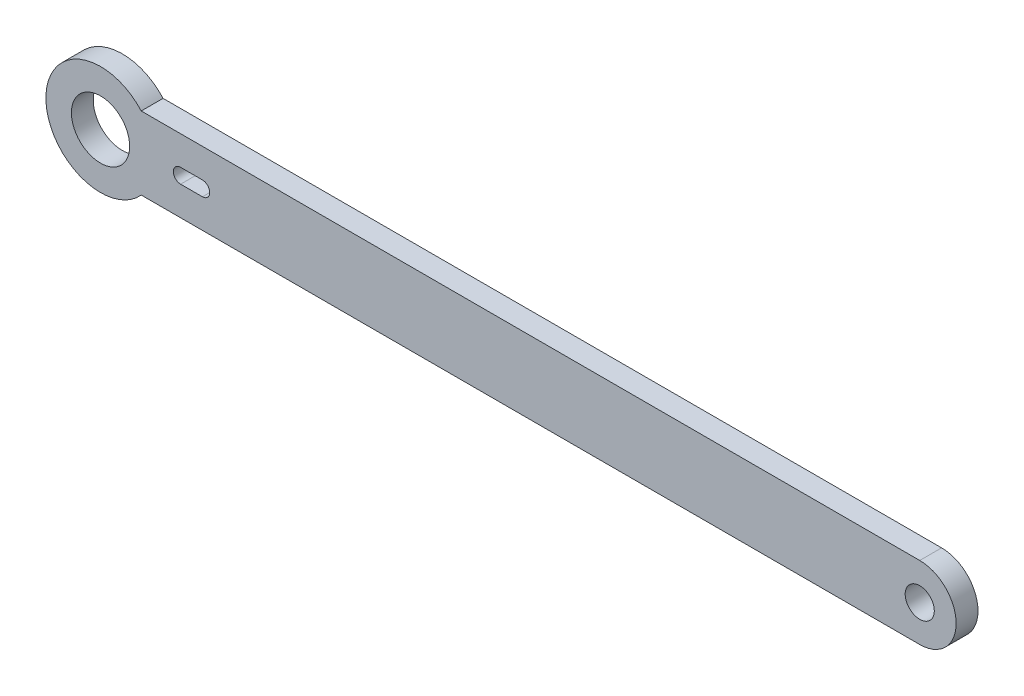
ISO-10303-21;
HEADER;
FILE_DESCRIPTION(('STEP AP214'),'2;1');
FILE_NAME('part.step','',(''),(''),'','','');
FILE_SCHEMA(('AUTOMOTIVE_DESIGN { 1 0 10303 214 1 1 1 1 }'));
ENDSEC;
DATA;
#1=APPLICATION_CONTEXT('core data for automotive mechanical design processes');
#2=APPLICATION_PROTOCOL_DEFINITION('international standard','automotive_design',2000,#1);
#3=PRODUCT_CONTEXT('',#1,'mechanical');
#4=PRODUCT('Part','Part','',(#3));
#5=PRODUCT_RELATED_PRODUCT_CATEGORY('part','',(#4));
#6=PRODUCT_DEFINITION_FORMATION('','',#4);
#7=PRODUCT_DEFINITION_CONTEXT('part definition',#1,'design');
#8=PRODUCT_DEFINITION('design','',#6,#7);
#9=PRODUCT_DEFINITION_SHAPE('','',#8);
#10=(LENGTH_UNIT() NAMED_UNIT(*) SI_UNIT(.MILLI.,.METRE.));
#11=(NAMED_UNIT(*) PLANE_ANGLE_UNIT() SI_UNIT($,.RADIAN.));
#12=(NAMED_UNIT(*) SI_UNIT($,.STERADIAN.) SOLID_ANGLE_UNIT());
#13=UNCERTAINTY_MEASURE_WITH_UNIT(LENGTH_MEASURE(1.E-05),#10,'distance_accuracy_value','');
#14=(GEOMETRIC_REPRESENTATION_CONTEXT(3) GLOBAL_UNCERTAINTY_ASSIGNED_CONTEXT((#13)) GLOBAL_UNIT_ASSIGNED_CONTEXT((#10,
#11,#12)) REPRESENTATION_CONTEXT('',''));
#15=CARTESIAN_POINT('',(0.,0.,0.));
#16=DIRECTION('',(0.,0.,1.));
#17=DIRECTION('',(1.,0.,0.));
#18=AXIS2_PLACEMENT_3D('',#15,#16,#17);
#19=CARTESIAN_POINT('',(0.,0.,1.5));
#20=DIRECTION('',(0.,0.,1.));
#21=DIRECTION('',(1.,0.,0.));
#22=AXIS2_PLACEMENT_3D('',#19,#20,#21);
#23=PLANE('',#22);
#24=CARTESIAN_POINT('',(112.5,0.,1.5));
#25=DIRECTION('',(0.,0.,1.));
#26=DIRECTION('',(1.,0.,0.));
#27=AXIS2_PLACEMENT_3D('',#24,#25,#26);
#28=CIRCLE('',#27,2.);
#29=CARTESIAN_POINT('',(114.5,0.,1.5));
#30=VERTEX_POINT('',#29);
#31=EDGE_CURVE('E139',#30,#30,#28,.T.);
#32=ORIENTED_EDGE('',*,*,#31,.F.);
#33=EDGE_LOOP('',(#32));
#34=FACE_BOUND('',#33,.T.);
#35=CARTESIAN_POINT('',(0.,0.,1.5));
#36=DIRECTION('',(0.,0.,1.));
#37=DIRECTION('',(1.,0.,0.));
#38=AXIS2_PLACEMENT_3D('',#35,#36,#37);
#39=CIRCLE('',#38,7.5);
#40=CARTESIAN_POINT('',(5.59016994374947,5.,1.5));
#41=VERTEX_POINT('',#40);
#42=CARTESIAN_POINT('',(5.59016994374947,-5.,1.5));
#43=VERTEX_POINT('',#42);
#44=EDGE_CURVE('E145',#41,#43,#39,.T.);
#45=ORIENTED_EDGE('',*,*,#44,.T.);
#46=DIRECTION('',(1.,0.,0.));
#47=VECTOR('',#46,1.);
#48=CARTESIAN_POINT('',(5.59016994374947,-5.,1.5));
#49=LINE('',#48,#47);
#50=CARTESIAN_POINT('',(112.5,-5.,1.5));
#51=VERTEX_POINT('',#50);
#52=EDGE_CURVE('E148',#43,#51,#49,.T.);
#53=ORIENTED_EDGE('',*,*,#52,.T.);
#54=CARTESIAN_POINT('',(112.5,0.,1.5));
#55=DIRECTION('',(0.,0.,1.));
#56=DIRECTION('',(1.,0.,0.));
#57=AXIS2_PLACEMENT_3D('',#54,#55,#56);
#58=CIRCLE('',#57,5.);
#59=CARTESIAN_POINT('',(112.5,5.,1.5));
#60=VERTEX_POINT('',#59);
#61=EDGE_CURVE('E151',#51,#60,#58,.T.);
#62=ORIENTED_EDGE('',*,*,#61,.T.);
#63=DIRECTION('',(-1.,0.,0.));
#64=VECTOR('',#63,1.);
#65=CARTESIAN_POINT('',(5.59016994374947,5.,1.5));
#66=LINE('',#65,#64);
#67=EDGE_CURVE('E153',#60,#41,#66,.T.);
#68=ORIENTED_EDGE('',*,*,#67,.T.);
#69=EDGE_LOOP('',(#45,#53,#62,#68));
#70=FACE_BOUND('',#69,.T.);
#71=CARTESIAN_POINT('',(0.,0.,1.5));
#72=DIRECTION('',(0.,0.,1.));
#73=DIRECTION('',(1.,0.,0.));
#74=AXIS2_PLACEMENT_3D('',#71,#72,#73);
#75=CIRCLE('',#74,4.);
#76=CARTESIAN_POINT('',(4.,0.,1.5));
#77=VERTEX_POINT('',#76);
#78=EDGE_CURVE('E133',#77,#77,#75,.T.);
#79=ORIENTED_EDGE('',*,*,#78,.F.);
#80=EDGE_LOOP('',(#79));
#81=FACE_BOUND('',#80,.T.);
#82=DIRECTION('',(1.,0.,0.));
#83=VECTOR('',#82,1.);
#84=CARTESIAN_POINT('',(11.,-1.,1.5));
#85=LINE('',#84,#83);
#86=CARTESIAN_POINT('',(11.,-1.,1.5));
#87=VERTEX_POINT('',#86);
#88=CARTESIAN_POINT('',(14.,-0.999999999999999,1.5));
#89=VERTEX_POINT('',#88);
#90=EDGE_CURVE('E105',#87,#89,#85,.T.);
#91=ORIENTED_EDGE('',*,*,#90,.F.);
#92=CARTESIAN_POINT('',(11.,0.,1.5));
#93=DIRECTION('',(0.,0.,1.));
#94=DIRECTION('',(1.,0.,0.));
#95=AXIS2_PLACEMENT_3D('',#92,#93,#94);
#96=CIRCLE('',#95,1.);
#97=CARTESIAN_POINT('',(11.,1.,1.5));
#98=VERTEX_POINT('',#97);
#99=EDGE_CURVE('E97',#98,#87,#96,.T.);
#100=ORIENTED_EDGE('',*,*,#99,.F.);
#101=DIRECTION('',(-1.,0.,0.));
#102=VECTOR('',#101,1.);
#103=CARTESIAN_POINT('',(11.,1.,1.5));
#104=LINE('',#103,#102);
#105=CARTESIAN_POINT('',(14.,0.999999999999999,1.5));
#106=VERTEX_POINT('',#105);
#107=EDGE_CURVE('E119',#106,#98,#104,.T.);
#108=ORIENTED_EDGE('',*,*,#107,.F.);
#109=CARTESIAN_POINT('',(14.,0.,1.5));
#110=DIRECTION('',(0.,0.,1.));
#111=DIRECTION('',(1.,0.,0.));
#112=AXIS2_PLACEMENT_3D('',#109,#110,#111);
#113=CIRCLE('',#112,0.999999999999999);
#114=EDGE_CURVE('E117',#89,#106,#113,.T.);
#115=ORIENTED_EDGE('',*,*,#114,.F.);
#116=EDGE_LOOP('',(#91,#100,#108,#115));
#117=FACE_BOUND('',#116,.T.);
#118=ADVANCED_FACE('F32',(#34,#70,#81,#117),#23,.T.);
#119=CARTESIAN_POINT('',(0.,0.,-1.5));
#120=DIRECTION('',(0.,0.,1.));
#121=DIRECTION('',(1.,0.,0.));
#122=AXIS2_PLACEMENT_3D('',#119,#120,#121);
#123=PLANE('',#122);
#124=CARTESIAN_POINT('',(0.,0.,-1.5));
#125=DIRECTION('',(0.,0.,1.));
#126=DIRECTION('',(1.,0.,0.));
#127=AXIS2_PLACEMENT_3D('',#124,#125,#126);
#128=CIRCLE('',#127,4.);
#129=CARTESIAN_POINT('',(4.,0.,-1.5));
#130=VERTEX_POINT('',#129);
#131=EDGE_CURVE('E113',#130,#130,#128,.T.);
#132=ORIENTED_EDGE('',*,*,#131,.T.);
#133=EDGE_LOOP('',(#132));
#134=FACE_BOUND('',#133,.T.);
#135=CARTESIAN_POINT('',(112.5,0.,-1.5));
#136=DIRECTION('',(0.,0.,1.));
#137=DIRECTION('',(1.,0.,0.));
#138=AXIS2_PLACEMENT_3D('',#135,#136,#137);
#139=CIRCLE('',#138,2.);
#140=CARTESIAN_POINT('',(114.5,0.,-1.5));
#141=VERTEX_POINT('',#140);
#142=EDGE_CURVE('E136',#141,#141,#139,.T.);
#143=ORIENTED_EDGE('',*,*,#142,.T.);
#144=EDGE_LOOP('',(#143));
#145=FACE_BOUND('',#144,.T.);
#146=CARTESIAN_POINT('',(0.,0.,-1.5));
#147=DIRECTION('',(0.,0.,1.));
#148=DIRECTION('',(1.,0.,0.));
#149=AXIS2_PLACEMENT_3D('',#146,#147,#148);
#150=CIRCLE('',#149,7.5);
#151=CARTESIAN_POINT('',(5.59016994374947,5.,-1.5));
#152=VERTEX_POINT('',#151);
#153=CARTESIAN_POINT('',(5.59016994374947,-5.,-1.5));
#154=VERTEX_POINT('',#153);
#155=EDGE_CURVE('E142',#152,#154,#150,.T.);
#156=ORIENTED_EDGE('',*,*,#155,.F.);
#157=DIRECTION('',(-1.,0.,0.));
#158=VECTOR('',#157,1.);
#159=CARTESIAN_POINT('',(5.59016994374947,5.,-1.5));
#160=LINE('',#159,#158);
#161=CARTESIAN_POINT('',(112.5,5.,-1.5));
#162=VERTEX_POINT('',#161);
#163=EDGE_CURVE('E149',#162,#152,#160,.T.);
#164=ORIENTED_EDGE('',*,*,#163,.F.);
#165=CARTESIAN_POINT('',(112.5,0.,-1.5));
#166=DIRECTION('',(0.,0.,1.));
#167=DIRECTION('',(1.,0.,0.));
#168=AXIS2_PLACEMENT_3D('',#165,#166,#167);
#169=CIRCLE('',#168,5.);
#170=CARTESIAN_POINT('',(112.5,-5.,-1.5));
#171=VERTEX_POINT('',#170);
#172=EDGE_CURVE('E160',#171,#162,#169,.T.);
#173=ORIENTED_EDGE('',*,*,#172,.F.);
#174=DIRECTION('',(1.,0.,0.));
#175=VECTOR('',#174,1.);
#176=CARTESIAN_POINT('',(5.59016994374947,-5.,-1.5));
#177=LINE('',#176,#175);
#178=EDGE_CURVE('E158',#154,#171,#177,.T.);
#179=ORIENTED_EDGE('',*,*,#178,.F.);
#180=EDGE_LOOP('',(#156,#164,#173,#179));
#181=FACE_BOUND('',#180,.T.);
#182=CARTESIAN_POINT('',(11.,0.,-1.5));
#183=DIRECTION('',(0.,0.,1.));
#184=DIRECTION('',(1.,0.,0.));
#185=AXIS2_PLACEMENT_3D('',#182,#183,#184);
#186=CIRCLE('',#185,1.);
#187=CARTESIAN_POINT('',(11.,1.,-1.5));
#188=VERTEX_POINT('',#187);
#189=CARTESIAN_POINT('',(11.,-1.,-1.5));
#190=VERTEX_POINT('',#189);
#191=EDGE_CURVE('E55',#188,#190,#186,.T.);
#192=ORIENTED_EDGE('',*,*,#191,.T.);
#193=DIRECTION('',(1.,0.,0.));
#194=VECTOR('',#193,1.);
#195=CARTESIAN_POINT('',(11.,-1.,-1.5));
#196=LINE('',#195,#194);
#197=CARTESIAN_POINT('',(14.,-0.999999999999999,-1.5));
#198=VERTEX_POINT('',#197);
#199=EDGE_CURVE('E112',#190,#198,#196,.T.);
#200=ORIENTED_EDGE('',*,*,#199,.T.);
#201=CARTESIAN_POINT('',(14.,0.,-1.5));
#202=DIRECTION('',(0.,0.,1.));
#203=DIRECTION('',(1.,0.,0.));
#204=AXIS2_PLACEMENT_3D('',#201,#202,#203);
#205=CIRCLE('',#204,0.999999999999999);
#206=CARTESIAN_POINT('',(14.,0.999999999999999,-1.5));
#207=VERTEX_POINT('',#206);
#208=EDGE_CURVE('E125',#198,#207,#205,.T.);
#209=ORIENTED_EDGE('',*,*,#208,.T.);
#210=DIRECTION('',(-1.,0.,0.));
#211=VECTOR('',#210,1.);
#212=CARTESIAN_POINT('',(11.,1.,-1.5));
#213=LINE('',#212,#211);
#214=EDGE_CURVE('E106',#207,#188,#213,.T.);
#215=ORIENTED_EDGE('',*,*,#214,.T.);
#216=EDGE_LOOP('',(#192,#200,#209,#215));
#217=FACE_BOUND('',#216,.T.);
#218=ADVANCED_FACE('F178',(#134,#145,#181,#217),#123,.F.);
#219=CARTESIAN_POINT('',(0.,0.,1.5));
#220=DIRECTION('',(0.,0.,-1.));
#221=DIRECTION('',(-1.,0.,0.));
#222=AXIS2_PLACEMENT_3D('',#219,#220,#221);
#223=CYLINDRICAL_SURFACE('',#222,7.5);
#224=ORIENTED_EDGE('',*,*,#155,.T.);
#225=DIRECTION('',(0.,0.,-1.));
#226=VECTOR('',#225,1.);
#227=CARTESIAN_POINT('',(5.59016994374947,-5.,1.5));
#228=LINE('',#227,#226);
#229=EDGE_CURVE('E11',#43,#154,#228,.T.);
#230=ORIENTED_EDGE('',*,*,#229,.F.);
#231=ORIENTED_EDGE('',*,*,#44,.F.);
#232=DIRECTION('',(0.,0.,-1.));
#233=VECTOR('',#232,1.);
#234=CARTESIAN_POINT('',(5.59016994374947,5.,1.5));
#235=LINE('',#234,#233);
#236=EDGE_CURVE('E155',#41,#152,#235,.T.);
#237=ORIENTED_EDGE('',*,*,#236,.T.);
#238=EDGE_LOOP('',(#224,#230,#231,#237));
#239=FACE_BOUND('',#238,.T.);
#240=ADVANCED_FACE('F34',(#239),#223,.T.);
#241=CARTESIAN_POINT('',(5.59016994374947,-5.,1.5));
#242=DIRECTION('',(0.,1.,0.));
#243=DIRECTION('',(0.,0.,1.));
#244=AXIS2_PLACEMENT_3D('',#241,#242,#243);
#245=PLANE('',#244);
#246=ORIENTED_EDGE('',*,*,#178,.T.);
#247=DIRECTION('',(0.,0.,-1.));
#248=VECTOR('',#247,1.);
#249=CARTESIAN_POINT('',(112.5,-5.,1.5));
#250=LINE('',#249,#248);
#251=EDGE_CURVE('E40',#51,#171,#250,.T.);
#252=ORIENTED_EDGE('',*,*,#251,.F.);
#253=ORIENTED_EDGE('',*,*,#52,.F.);
#254=ORIENTED_EDGE('',*,*,#229,.T.);
#255=EDGE_LOOP('',(#246,#252,#253,#254));
#256=FACE_BOUND('',#255,.T.);
#257=ADVANCED_FACE('F189',(#256),#245,.F.);
#258=CARTESIAN_POINT('',(112.5,0.,1.5));
#259=DIRECTION('',(0.,0.,-1.));
#260=DIRECTION('',(-1.,0.,0.));
#261=AXIS2_PLACEMENT_3D('',#258,#259,#260);
#262=CYLINDRICAL_SURFACE('',#261,5.);
#263=ORIENTED_EDGE('',*,*,#172,.T.);
#264=DIRECTION('',(0.,0.,-1.));
#265=VECTOR('',#264,1.);
#266=CARTESIAN_POINT('',(112.5,5.,1.5));
#267=LINE('',#266,#265);
#268=EDGE_CURVE('E165',#60,#162,#267,.T.);
#269=ORIENTED_EDGE('',*,*,#268,.F.);
#270=ORIENTED_EDGE('',*,*,#61,.F.);
#271=ORIENTED_EDGE('',*,*,#251,.T.);
#272=EDGE_LOOP('',(#263,#269,#270,#271));
#273=FACE_BOUND('',#272,.T.);
#274=ADVANCED_FACE('F172',(#273),#262,.T.);
#275=CARTESIAN_POINT('',(5.59016994374947,5.,1.5));
#276=DIRECTION('',(0.,-1.,0.));
#277=DIRECTION('',(0.,0.,-1.));
#278=AXIS2_PLACEMENT_3D('',#275,#276,#277);
#279=PLANE('',#278);
#280=ORIENTED_EDGE('',*,*,#163,.T.);
#281=ORIENTED_EDGE('',*,*,#236,.F.);
#282=ORIENTED_EDGE('',*,*,#67,.F.);
#283=ORIENTED_EDGE('',*,*,#268,.T.);
#284=EDGE_LOOP('',(#280,#281,#282,#283));
#285=FACE_BOUND('',#284,.T.);
#286=ADVANCED_FACE('F182',(#285),#279,.F.);
#287=CARTESIAN_POINT('',(112.5,0.,1.5));
#288=DIRECTION('',(0.,0.,-1.));
#289=DIRECTION('',(-1.,0.,0.));
#290=AXIS2_PLACEMENT_3D('',#287,#288,#289);
#291=CYLINDRICAL_SURFACE('',#290,2.);
#292=ORIENTED_EDGE('',*,*,#31,.T.);
#293=EDGE_LOOP('',(#292));
#294=FACE_BOUND('',#293,.T.);
#295=ORIENTED_EDGE('',*,*,#142,.F.);
#296=EDGE_LOOP('',(#295));
#297=FACE_BOUND('',#296,.T.);
#298=ADVANCED_FACE('F206',(#294,#297),#291,.F.);
#299=CARTESIAN_POINT('',(0.,0.,1.5));
#300=DIRECTION('',(0.,0.,-1.));
#301=DIRECTION('',(-1.,0.,0.));
#302=AXIS2_PLACEMENT_3D('',#299,#300,#301);
#303=CYLINDRICAL_SURFACE('',#302,4.);
#304=ORIENTED_EDGE('',*,*,#78,.T.);
#305=EDGE_LOOP('',(#304));
#306=FACE_BOUND('',#305,.T.);
#307=ORIENTED_EDGE('',*,*,#131,.F.);
#308=EDGE_LOOP('',(#307));
#309=FACE_BOUND('',#308,.T.);
#310=ADVANCED_FACE('F213',(#306,#309),#303,.F.);
#311=CARTESIAN_POINT('',(11.,0.,1.5));
#312=DIRECTION('',(0.,0.,-1.));
#313=DIRECTION('',(-1.,0.,0.));
#314=AXIS2_PLACEMENT_3D('',#311,#312,#313);
#315=CYLINDRICAL_SURFACE('',#314,1.);
#316=ORIENTED_EDGE('',*,*,#191,.F.);
#317=DIRECTION('',(0.,0.,-1.));
#318=VECTOR('',#317,1.);
#319=CARTESIAN_POINT('',(11.,1.,1.5));
#320=LINE('',#319,#318);
#321=EDGE_CURVE('E101',#98,#188,#320,.T.);
#322=ORIENTED_EDGE('',*,*,#321,.F.);
#323=ORIENTED_EDGE('',*,*,#99,.T.);
#324=DIRECTION('',(0.,0.,-1.));
#325=VECTOR('',#324,1.);
#326=CARTESIAN_POINT('',(11.,-1.,1.5));
#327=LINE('',#326,#325);
#328=EDGE_CURVE('E100',#87,#190,#327,.T.);
#329=ORIENTED_EDGE('',*,*,#328,.T.);
#330=EDGE_LOOP('',(#316,#322,#323,#329));
#331=FACE_BOUND('',#330,.T.);
#332=ADVANCED_FACE('F99',(#331),#315,.F.);
#333=CARTESIAN_POINT('',(11.,-1.,1.5));
#334=DIRECTION('',(0.,1.,0.));
#335=DIRECTION('',(-1.,0.,0.));
#336=AXIS2_PLACEMENT_3D('',#333,#334,#335);
#337=PLANE('',#336);
#338=ORIENTED_EDGE('',*,*,#199,.F.);
#339=ORIENTED_EDGE('',*,*,#328,.F.);
#340=ORIENTED_EDGE('',*,*,#90,.T.);
#341=DIRECTION('',(0.,0.,-1.));
#342=VECTOR('',#341,1.);
#343=CARTESIAN_POINT('',(14.,-0.999999999999999,1.5));
#344=LINE('',#343,#342);
#345=EDGE_CURVE('E114',#89,#198,#344,.T.);
#346=ORIENTED_EDGE('',*,*,#345,.T.);
#347=EDGE_LOOP('',(#338,#339,#340,#346));
#348=FACE_BOUND('',#347,.T.);
#349=ADVANCED_FACE('F109',(#348),#337,.T.);
#350=CARTESIAN_POINT('',(14.,0.,1.5));
#351=DIRECTION('',(0.,0.,-1.));
#352=DIRECTION('',(-1.,0.,0.));
#353=AXIS2_PLACEMENT_3D('',#350,#351,#352);
#354=CYLINDRICAL_SURFACE('',#353,0.999999999999999);
#355=ORIENTED_EDGE('',*,*,#208,.F.);
#356=ORIENTED_EDGE('',*,*,#345,.F.);
#357=ORIENTED_EDGE('',*,*,#114,.T.);
#358=DIRECTION('',(0.,0.,-1.));
#359=VECTOR('',#358,1.);
#360=CARTESIAN_POINT('',(14.,0.999999999999999,1.5));
#361=LINE('',#360,#359);
#362=EDGE_CURVE('E47',#106,#207,#361,.T.);
#363=ORIENTED_EDGE('',*,*,#362,.T.);
#364=EDGE_LOOP('',(#355,#356,#357,#363));
#365=FACE_BOUND('',#364,.T.);
#366=ADVANCED_FACE('F230',(#365),#354,.F.);
#367=CARTESIAN_POINT('',(11.,1.,1.5));
#368=DIRECTION('',(0.,-1.,0.));
#369=DIRECTION('',(1.,0.,0.));
#370=AXIS2_PLACEMENT_3D('',#367,#368,#369);
#371=PLANE('',#370);
#372=ORIENTED_EDGE('',*,*,#214,.F.);
#373=ORIENTED_EDGE('',*,*,#362,.F.);
#374=ORIENTED_EDGE('',*,*,#107,.T.);
#375=ORIENTED_EDGE('',*,*,#321,.T.);
#376=EDGE_LOOP('',(#372,#373,#374,#375));
#377=FACE_BOUND('',#376,.T.);
#378=ADVANCED_FACE('F233',(#377),#371,.T.);
#379=CLOSED_SHELL('',(#118,#218,#240,#257,#274,#286,#298,#310,#332,#349,#366,#378));
#380=MANIFOLD_SOLID_BREP('B2',#379);
#381=ADVANCED_BREP_SHAPE_REPRESENTATION('',(#18,#380),#14);
#382=SHAPE_DEFINITION_REPRESENTATION(#9,#381);
ENDSEC;
END-ISO-10303-21;
